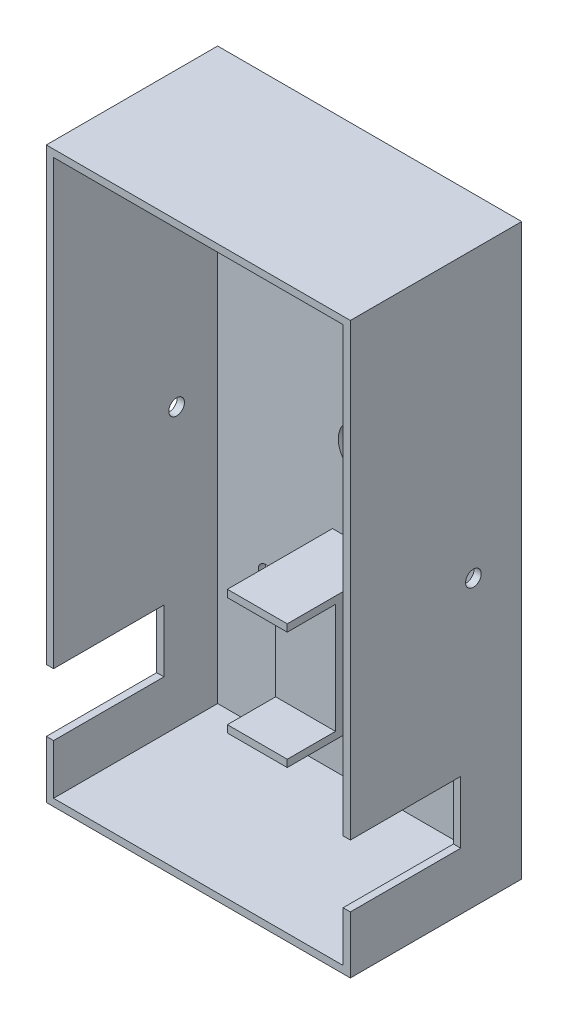
ISO-10303-21;
HEADER;
FILE_DESCRIPTION(('STEP AP214'),'2;1');
FILE_NAME('part.step','',(''),(''),'','','');
FILE_SCHEMA(('AUTOMOTIVE_DESIGN { 1 0 10303 214 1 1 1 1 }'));
ENDSEC;
DATA;
#1=APPLICATION_CONTEXT('core data for automotive mechanical design processes');
#2=APPLICATION_PROTOCOL_DEFINITION('international standard','automotive_design',2000,#1);
#3=PRODUCT_CONTEXT('',#1,'mechanical');
#4=PRODUCT('Part','Part','',(#3));
#5=PRODUCT_RELATED_PRODUCT_CATEGORY('part','',(#4));
#6=PRODUCT_DEFINITION_FORMATION('','',#4);
#7=PRODUCT_DEFINITION_CONTEXT('part definition',#1,'design');
#8=PRODUCT_DEFINITION('design','',#6,#7);
#9=PRODUCT_DEFINITION_SHAPE('','',#8);
#10=(LENGTH_UNIT() NAMED_UNIT(*) SI_UNIT(.MILLI.,.METRE.));
#11=(NAMED_UNIT(*) PLANE_ANGLE_UNIT() SI_UNIT($,.RADIAN.));
#12=(NAMED_UNIT(*) SI_UNIT($,.STERADIAN.) SOLID_ANGLE_UNIT());
#13=UNCERTAINTY_MEASURE_WITH_UNIT(LENGTH_MEASURE(1.E-05),#10,'distance_accuracy_value','');
#14=(GEOMETRIC_REPRESENTATION_CONTEXT(3) GLOBAL_UNCERTAINTY_ASSIGNED_CONTEXT((#13)) GLOBAL_UNIT_ASSIGNED_CONTEXT((#10,
#11,#12)) REPRESENTATION_CONTEXT('',''));
#15=CARTESIAN_POINT('',(0.,0.,0.));
#16=DIRECTION('',(0.,0.,1.));
#17=DIRECTION('',(1.,0.,0.));
#18=AXIS2_PLACEMENT_3D('',#15,#16,#17);
#19=CARTESIAN_POINT('',(30.,18.25,21.78));
#20=DIRECTION('',(0.,0.,1.));
#21=DIRECTION('',(1.,0.,0.));
#22=AXIS2_PLACEMENT_3D('',#19,#20,#21);
#23=PLANE('',#22);
#24=DIRECTION('',(0.,1.,0.));
#25=VECTOR('',#24,1.);
#26=CARTESIAN_POINT('',(36.2,73.8,21.78));
#27=LINE('',#26,#25);
#28=CARTESIAN_POINT('',(36.2,17.5,21.78));
#29=VERTEX_POINT('',#28);
#30=CARTESIAN_POINT('',(36.2,19.,21.78));
#31=VERTEX_POINT('',#30);
#32=EDGE_CURVE('E195',#29,#31,#27,.T.);
#33=ORIENTED_EDGE('',*,*,#32,.T.);
#34=DIRECTION('',(1.,0.,0.));
#35=VECTOR('',#34,1.);
#36=CARTESIAN_POINT('',(36.2,19.,21.78));
#37=LINE('',#36,#35);
#38=CARTESIAN_POINT('',(23.8,19.,21.78));
#39=VERTEX_POINT('',#38);
#40=EDGE_CURVE('E182',#39,#31,#37,.T.);
#41=ORIENTED_EDGE('',*,*,#40,.F.);
#42=DIRECTION('',(0.,1.,0.));
#43=VECTOR('',#42,1.);
#44=CARTESIAN_POINT('',(23.8,18.25,21.78));
#45=LINE('',#44,#43);
#46=CARTESIAN_POINT('',(23.8,17.5,21.78));
#47=VERTEX_POINT('',#46);
#48=EDGE_CURVE('E189',#39,#47,#45,.F.);
#49=ORIENTED_EDGE('',*,*,#48,.T.);
#50=DIRECTION('',(1.,0.,0.));
#51=VECTOR('',#50,1.);
#52=CARTESIAN_POINT('',(23.8,17.5,21.78));
#53=LINE('',#52,#51);
#54=EDGE_CURVE('E202',#29,#47,#53,.F.);
#55=ORIENTED_EDGE('',*,*,#54,.F.);
#56=EDGE_LOOP('',(#33,#41,#49,#55));
#57=FACE_BOUND('',#56,.T.);
#58=ADVANCED_FACE('F16',(#57),#23,.T.);
#59=CARTESIAN_POINT('',(36.2,19.,11.78));
#60=DIRECTION('',(0.,1.,0.));
#61=DIRECTION('',(0.,0.,1.));
#62=AXIS2_PLACEMENT_3D('',#59,#60,#61);
#63=PLANE('',#62);
#64=ORIENTED_EDGE('',*,*,#40,.T.);
#65=DIRECTION('',(0.,0.,1.));
#66=VECTOR('',#65,1.);
#67=CARTESIAN_POINT('',(36.2,19.,0.));
#68=LINE('',#67,#66);
#69=CARTESIAN_POINT('',(36.2,19.,11.78));
#70=VERTEX_POINT('',#69);
#71=EDGE_CURVE('E185',#31,#70,#68,.F.);
#72=ORIENTED_EDGE('',*,*,#71,.T.);
#73=DIRECTION('',(1.,0.,0.));
#74=VECTOR('',#73,1.);
#75=CARTESIAN_POINT('',(26.9,19.,11.78));
#76=LINE('',#75,#74);
#77=CARTESIAN_POINT('',(23.8,19.,11.78));
#78=VERTEX_POINT('',#77);
#79=EDGE_CURVE('E175',#78,#70,#76,.T.);
#80=ORIENTED_EDGE('',*,*,#79,.F.);
#81=DIRECTION('',(0.,0.,1.));
#82=VECTOR('',#81,1.);
#83=CARTESIAN_POINT('',(23.8,19.,0.));
#84=LINE('',#83,#82);
#85=EDGE_CURVE('E186',#39,#78,#84,.F.);
#86=ORIENTED_EDGE('',*,*,#85,.F.);
#87=EDGE_LOOP('',(#64,#72,#80,#86));
#88=FACE_BOUND('',#87,.T.);
#89=ADVANCED_FACE('F184',(#88),#63,.T.);
#90=CARTESIAN_POINT('',(26.9,60.9,11.78));
#91=DIRECTION('',(0.,0.,1.));
#92=DIRECTION('',(1.,0.,0.));
#93=AXIS2_PLACEMENT_3D('',#90,#91,#92);
#94=PLANE('',#93);
#95=DIRECTION('',(1.,0.,0.));
#96=VECTOR('',#95,1.);
#97=CARTESIAN_POINT('',(23.8,41.8,11.78));
#98=LINE('',#97,#96);
#99=CARTESIAN_POINT('',(23.8,41.8,11.78));
#100=VERTEX_POINT('',#99);
#101=CARTESIAN_POINT('',(36.2,41.8,11.78));
#102=VERTEX_POINT('',#101);
#103=EDGE_CURVE('E216',#100,#102,#98,.T.);
#104=ORIENTED_EDGE('',*,*,#103,.F.);
#105=DIRECTION('',(0.,1.,0.));
#106=VECTOR('',#105,1.);
#107=CARTESIAN_POINT('',(23.8,73.8,11.78));
#108=LINE('',#107,#106);
#109=EDGE_CURVE('E323',#78,#100,#108,.T.);
#110=ORIENTED_EDGE('',*,*,#109,.F.);
#111=ORIENTED_EDGE('',*,*,#79,.T.);
#112=DIRECTION('',(0.,1.,0.));
#113=VECTOR('',#112,1.);
#114=CARTESIAN_POINT('',(36.2,73.8,11.78));
#115=LINE('',#114,#113);
#116=EDGE_CURVE('E198',#70,#102,#115,.T.);
#117=ORIENTED_EDGE('',*,*,#116,.T.);
#118=EDGE_LOOP('',(#104,#110,#111,#117));
#119=FACE_BOUND('',#118,.T.);
#120=ADVANCED_FACE('F337',(#119),#94,.T.);
#121=CARTESIAN_POINT('',(23.8,41.8,11.78));
#122=DIRECTION('',(0.,-1.,0.));
#123=DIRECTION('',(0.,0.,-1.));
#124=AXIS2_PLACEMENT_3D('',#121,#122,#123);
#125=PLANE('',#124);
#126=DIRECTION('',(1.,0.,0.));
#127=VECTOR('',#126,1.);
#128=CARTESIAN_POINT('',(30.,41.8,21.78));
#129=LINE('',#128,#127);
#130=CARTESIAN_POINT('',(23.8,41.8,21.78));
#131=VERTEX_POINT('',#130);
#132=CARTESIAN_POINT('',(36.2,41.8,21.78));
#133=VERTEX_POINT('',#132);
#134=EDGE_CURVE('E214',#131,#133,#129,.T.);
#135=ORIENTED_EDGE('',*,*,#134,.F.);
#136=DIRECTION('',(0.,0.,1.));
#137=VECTOR('',#136,1.);
#138=CARTESIAN_POINT('',(23.8,41.8,0.));
#139=LINE('',#138,#137);
#140=EDGE_CURVE('E321',#100,#131,#139,.T.);
#141=ORIENTED_EDGE('',*,*,#140,.F.);
#142=ORIENTED_EDGE('',*,*,#103,.T.);
#143=DIRECTION('',(0.,0.,1.));
#144=VECTOR('',#143,1.);
#145=CARTESIAN_POINT('',(36.2,41.8,0.));
#146=LINE('',#145,#144);
#147=EDGE_CURVE('E334',#102,#133,#146,.T.);
#148=ORIENTED_EDGE('',*,*,#147,.T.);
#149=EDGE_LOOP('',(#135,#141,#142,#148));
#150=FACE_BOUND('',#149,.T.);
#151=ADVANCED_FACE('F341',(#150),#125,.T.);
#152=CARTESIAN_POINT('',(30.,42.55,21.78));
#153=DIRECTION('',(0.,0.,1.));
#154=DIRECTION('',(1.,0.,0.));
#155=AXIS2_PLACEMENT_3D('',#152,#153,#154);
#156=PLANE('',#155);
#157=DIRECTION('',(1.,0.,0.));
#158=VECTOR('',#157,1.);
#159=CARTESIAN_POINT('',(30.,43.3,21.78));
#160=LINE('',#159,#158);
#161=CARTESIAN_POINT('',(36.2,43.3,21.78));
#162=VERTEX_POINT('',#161);
#163=CARTESIAN_POINT('',(23.8,43.3,21.78));
#164=VERTEX_POINT('',#163);
#165=EDGE_CURVE('E313',#162,#164,#160,.F.);
#166=ORIENTED_EDGE('',*,*,#165,.T.);
#167=DIRECTION('',(0.,1.,0.));
#168=VECTOR('',#167,1.);
#169=CARTESIAN_POINT('',(23.8,73.8,21.78));
#170=LINE('',#169,#168);
#171=EDGE_CURVE('E319',#131,#164,#170,.T.);
#172=ORIENTED_EDGE('',*,*,#171,.F.);
#173=ORIENTED_EDGE('',*,*,#134,.T.);
#174=DIRECTION('',(0.,1.,0.));
#175=VECTOR('',#174,1.);
#176=CARTESIAN_POINT('',(36.2,73.8,21.78));
#177=LINE('',#176,#175);
#178=EDGE_CURVE('E332',#133,#162,#177,.T.);
#179=ORIENTED_EDGE('',*,*,#178,.T.);
#180=EDGE_LOOP('',(#166,#172,#173,#179));
#181=FACE_BOUND('',#180,.T.);
#182=ADVANCED_FACE('F462',(#181),#156,.T.);
#183=CARTESIAN_POINT('',(0.,115.,0.));
#184=DIRECTION('',(0.,-1.,0.));
#185=DIRECTION('',(0.,0.,-1.));
#186=AXIS2_PLACEMENT_3D('',#183,#184,#185);
#187=PLANE('',#186);
#188=DIRECTION('',(1.,0.,0.));
#189=VECTOR('',#188,1.);
#190=CARTESIAN_POINT('',(30.,115.,34.));
#191=LINE('',#190,#189);
#192=CARTESIAN_POINT('',(0.,115.,34.));
#193=VERTEX_POINT('',#192);
#194=CARTESIAN_POINT('',(60.,115.,34.));
#195=VERTEX_POINT('',#194);
#196=EDGE_CURVE('E279',#193,#195,#191,.T.);
#197=ORIENTED_EDGE('',*,*,#196,.F.);
#198=DIRECTION('',(0.,0.,-1.));
#199=VECTOR('',#198,1.);
#200=CARTESIAN_POINT('',(0.,115.,0.));
#201=LINE('',#200,#199);
#202=CARTESIAN_POINT('',(0.,115.,0.));
#203=VERTEX_POINT('',#202);
#204=EDGE_CURVE('E212',#203,#193,#201,.F.);
#205=ORIENTED_EDGE('',*,*,#204,.F.);
#206=DIRECTION('',(1.,0.,0.));
#207=VECTOR('',#206,1.);
#208=CARTESIAN_POINT('',(30.,115.,0.));
#209=LINE('',#208,#207);
#210=CARTESIAN_POINT('',(60.,115.,0.));
#211=VERTEX_POINT('',#210);
#212=EDGE_CURVE('E368',#211,#203,#209,.F.);
#213=ORIENTED_EDGE('',*,*,#212,.F.);
#214=DIRECTION('',(0.,0.,1.));
#215=VECTOR('',#214,1.);
#216=CARTESIAN_POINT('',(60.,115.,0.));
#217=LINE('',#216,#215);
#218=EDGE_CURVE('E205',#195,#211,#217,.F.);
#219=ORIENTED_EDGE('',*,*,#218,.F.);
#220=EDGE_LOOP('',(#197,#205,#213,#219));
#221=FACE_BOUND('',#220,.T.);
#222=ADVANCED_FACE('F407',(#221),#187,.T.);
#223=CARTESIAN_POINT('',(0.,0.,0.));
#224=DIRECTION('',(1.,0.,0.));
#225=DIRECTION('',(0.,0.,-1.));
#226=AXIS2_PLACEMENT_3D('',#223,#224,#225);
#227=PLANE('',#226);
#228=CARTESIAN_POINT('',(0.,57.5,8.5));
#229=DIRECTION('',(-1.,0.,0.));
#230=DIRECTION('',(0.,0.,1.));
#231=AXIS2_PLACEMENT_3D('',#228,#229,#230);
#232=CIRCLE('',#231,1.6256);
#233=CARTESIAN_POINT('',(0.,57.5,10.1256));
#234=VERTEX_POINT('',#233);
#235=EDGE_CURVE('E257',#234,#234,#232,.T.);
#236=ORIENTED_EDGE('',*,*,#235,.T.);
#237=EDGE_LOOP('',(#236));
#238=FACE_BOUND('',#237,.T.);
#239=ORIENTED_EDGE('',*,*,#204,.T.);
#240=DIRECTION('',(0.,1.,0.));
#241=VECTOR('',#240,1.);
#242=CARTESIAN_POINT('',(0.,57.5,34.));
#243=LINE('',#242,#241);
#244=CARTESIAN_POINT('',(0.,23.25,34.));
#245=VERTEX_POINT('',#244);
#246=EDGE_CURVE('E281',#245,#193,#243,.T.);
#247=ORIENTED_EDGE('',*,*,#246,.F.);
#248=DIRECTION('',(0.,0.,1.));
#249=VECTOR('',#248,1.);
#250=CARTESIAN_POINT('',(0.,23.25,34.));
#251=LINE('',#250,#249);
#252=CARTESIAN_POINT('',(0.,23.25,11.13));
#253=VERTEX_POINT('',#252);
#254=EDGE_CURVE('E287',#245,#253,#251,.F.);
#255=ORIENTED_EDGE('',*,*,#254,.T.);
#256=DIRECTION('',(0.,1.,0.));
#257=VECTOR('',#256,1.);
#258=CARTESIAN_POINT('',(0.,16.25,11.13));
#259=LINE('',#258,#257);
#260=CARTESIAN_POINT('',(0.,10.36,11.13));
#261=VERTEX_POINT('',#260);
#262=EDGE_CURVE('E293',#253,#261,#259,.F.);
#263=ORIENTED_EDGE('',*,*,#262,.T.);
#264=DIRECTION('',(0.,0.,-1.));
#265=VECTOR('',#264,1.);
#266=CARTESIAN_POINT('',(0.,10.36,11.13));
#267=LINE('',#266,#265);
#268=CARTESIAN_POINT('',(0.,10.36,34.));
#269=VERTEX_POINT('',#268);
#270=EDGE_CURVE('E260',#261,#269,#267,.F.);
#271=ORIENTED_EDGE('',*,*,#270,.T.);
#272=DIRECTION('',(0.,1.,0.));
#273=VECTOR('',#272,1.);
#274=CARTESIAN_POINT('',(0.,57.5,34.));
#275=LINE('',#274,#273);
#276=CARTESIAN_POINT('',(0.,0.,34.));
#277=VERTEX_POINT('',#276);
#278=EDGE_CURVE('E370',#277,#269,#275,.T.);
#279=ORIENTED_EDGE('',*,*,#278,.F.);
#280=DIRECTION('',(0.,0.,1.));
#281=VECTOR('',#280,1.);
#282=CARTESIAN_POINT('',(0.,0.,0.));
#283=LINE('',#282,#281);
#284=CARTESIAN_POINT('',(0.,0.,0.));
#285=VERTEX_POINT('',#284);
#286=EDGE_CURVE('E210',#285,#277,#283,.T.);
#287=ORIENTED_EDGE('',*,*,#286,.F.);
#288=DIRECTION('',(0.,1.,0.));
#289=VECTOR('',#288,1.);
#290=CARTESIAN_POINT('',(0.,57.5,0.));
#291=LINE('',#290,#289);
#292=EDGE_CURVE('E366',#203,#285,#291,.F.);
#293=ORIENTED_EDGE('',*,*,#292,.F.);
#294=EDGE_LOOP('',(#239,#247,#255,#263,#271,#279,#287,#293));
#295=FACE_BOUND('',#294,.T.);
#296=ADVANCED_FACE('F397',(#238,#295),#227,.T.);
#297=CARTESIAN_POINT('',(60.,0.,0.));
#298=DIRECTION('',(0.,1.,0.));
#299=DIRECTION('',(0.,0.,1.));
#300=AXIS2_PLACEMENT_3D('',#297,#298,#299);
#301=PLANE('',#300);
#302=DIRECTION('',(1.,0.,0.));
#303=VECTOR('',#302,1.);
#304=CARTESIAN_POINT('',(30.,0.,34.));
#305=LINE('',#304,#303);
#306=CARTESIAN_POINT('',(60.,0.,34.));
#307=VERTEX_POINT('',#306);
#308=EDGE_CURVE('E372',#307,#277,#305,.F.);
#309=ORIENTED_EDGE('',*,*,#308,.F.);
#310=DIRECTION('',(0.,0.,1.));
#311=VECTOR('',#310,1.);
#312=CARTESIAN_POINT('',(60.,0.,0.));
#313=LINE('',#312,#311);
#314=CARTESIAN_POINT('',(60.,0.,0.));
#315=VERTEX_POINT('',#314);
#316=EDGE_CURVE('E203',#315,#307,#313,.T.);
#317=ORIENTED_EDGE('',*,*,#316,.F.);
#318=DIRECTION('',(1.,0.,0.));
#319=VECTOR('',#318,1.);
#320=CARTESIAN_POINT('',(30.,0.,0.));
#321=LINE('',#320,#319);
#322=EDGE_CURVE('E361',#285,#315,#321,.T.);
#323=ORIENTED_EDGE('',*,*,#322,.F.);
#324=ORIENTED_EDGE('',*,*,#286,.T.);
#325=EDGE_LOOP('',(#309,#317,#323,#324));
#326=FACE_BOUND('',#325,.T.);
#327=ADVANCED_FACE('F394',(#326),#301,.T.);
#328=CARTESIAN_POINT('',(60.,115.,0.));
#329=DIRECTION('',(-1.,0.,0.));
#330=DIRECTION('',(0.,0.,1.));
#331=AXIS2_PLACEMENT_3D('',#328,#329,#330);
#332=PLANE('',#331);
#333=CARTESIAN_POINT('',(60.,57.5,8.5));
#334=DIRECTION('',(-1.,0.,0.));
#335=DIRECTION('',(0.,0.,1.));
#336=AXIS2_PLACEMENT_3D('',#333,#334,#335);
#337=CIRCLE('',#336,1.6256);
#338=CARTESIAN_POINT('',(60.,57.5,10.1256));
#339=VERTEX_POINT('',#338);
#340=EDGE_CURVE('E19',#339,#339,#337,.F.);
#341=ORIENTED_EDGE('',*,*,#340,.T.);
#342=EDGE_LOOP('',(#341));
#343=FACE_BOUND('',#342,.T.);
#344=DIRECTION('',(0.,0.,-1.));
#345=VECTOR('',#344,1.);
#346=CARTESIAN_POINT('',(60.,10.36,11.13));
#347=LINE('',#346,#345);
#348=CARTESIAN_POINT('',(60.,10.36,34.));
#349=VERTEX_POINT('',#348);
#350=CARTESIAN_POINT('',(60.,10.36,11.13));
#351=VERTEX_POINT('',#350);
#352=EDGE_CURVE('E295',#349,#351,#347,.T.);
#353=ORIENTED_EDGE('',*,*,#352,.T.);
#354=DIRECTION('',(0.,1.,0.));
#355=VECTOR('',#354,1.);
#356=CARTESIAN_POINT('',(60.,16.25,11.13));
#357=LINE('',#356,#355);
#358=CARTESIAN_POINT('',(60.,23.25,11.13));
#359=VERTEX_POINT('',#358);
#360=EDGE_CURVE('E301',#351,#359,#357,.T.);
#361=ORIENTED_EDGE('',*,*,#360,.T.);
#362=DIRECTION('',(0.,0.,1.));
#363=VECTOR('',#362,1.);
#364=CARTESIAN_POINT('',(60.,23.25,34.));
#365=LINE('',#364,#363);
#366=CARTESIAN_POINT('',(60.,23.25,34.));
#367=VERTEX_POINT('',#366);
#368=EDGE_CURVE('E307',#359,#367,#365,.T.);
#369=ORIENTED_EDGE('',*,*,#368,.T.);
#370=DIRECTION('',(0.,1.,0.));
#371=VECTOR('',#370,1.);
#372=CARTESIAN_POINT('',(60.,57.5,34.));
#373=LINE('',#372,#371);
#374=EDGE_CURVE('E277',#195,#367,#373,.F.);
#375=ORIENTED_EDGE('',*,*,#374,.F.);
#376=ORIENTED_EDGE('',*,*,#218,.T.);
#377=DIRECTION('',(0.,1.,0.));
#378=VECTOR('',#377,1.);
#379=CARTESIAN_POINT('',(60.,57.5,0.));
#380=LINE('',#379,#378);
#381=EDGE_CURVE('E356',#315,#211,#380,.T.);
#382=ORIENTED_EDGE('',*,*,#381,.F.);
#383=ORIENTED_EDGE('',*,*,#316,.T.);
#384=DIRECTION('',(0.,1.,0.));
#385=VECTOR('',#384,1.);
#386=CARTESIAN_POINT('',(60.,57.5,34.));
#387=LINE('',#386,#385);
#388=EDGE_CURVE('E375',#349,#307,#387,.F.);
#389=ORIENTED_EDGE('',*,*,#388,.F.);
#390=EDGE_LOOP('',(#353,#361,#369,#375,#376,#382,#383,#389));
#391=FACE_BOUND('',#390,.T.);
#392=ADVANCED_FACE('F389',(#343,#391),#332,.T.);
#393=CARTESIAN_POINT('',(36.2,73.8,0.));
#394=DIRECTION('',(-1.,0.,0.));
#395=DIRECTION('',(0.,0.,1.));
#396=AXIS2_PLACEMENT_3D('',#393,#394,#395);
#397=PLANE('',#396);
#398=ORIENTED_EDGE('',*,*,#178,.F.);
#399=ORIENTED_EDGE('',*,*,#147,.F.);
#400=ORIENTED_EDGE('',*,*,#116,.F.);
#401=ORIENTED_EDGE('',*,*,#71,.F.);
#402=ORIENTED_EDGE('',*,*,#32,.F.);
#403=DIRECTION('',(0.,0.,-1.));
#404=VECTOR('',#403,1.);
#405=CARTESIAN_POINT('',(36.2,17.5,0.));
#406=LINE('',#405,#404);
#407=CARTESIAN_POINT('',(36.2,17.5,0.));
#408=VERTEX_POINT('',#407);
#409=EDGE_CURVE('E330',#408,#29,#406,.F.);
#410=ORIENTED_EDGE('',*,*,#409,.F.);
#411=DIRECTION('',(0.,1.,0.));
#412=VECTOR('',#411,1.);
#413=CARTESIAN_POINT('',(36.2,57.5,0.));
#414=LINE('',#413,#412);
#415=CARTESIAN_POINT('',(36.2,43.3,0.));
#416=VERTEX_POINT('',#415);
#417=EDGE_CURVE('E353',#416,#408,#414,.F.);
#418=ORIENTED_EDGE('',*,*,#417,.F.);
#419=DIRECTION('',(0.,0.,-1.));
#420=VECTOR('',#419,1.);
#421=CARTESIAN_POINT('',(36.2,43.3,0.));
#422=LINE('',#421,#420);
#423=EDGE_CURVE('E316',#416,#162,#422,.F.);
#424=ORIENTED_EDGE('',*,*,#423,.T.);
#425=EDGE_LOOP('',(#398,#399,#400,#401,#402,#410,#418,#424));
#426=FACE_BOUND('',#425,.T.);
#427=ADVANCED_FACE('F193',(#426),#397,.F.);
#428=CARTESIAN_POINT('',(23.8,17.5,0.));
#429=DIRECTION('',(0.,-1.,0.));
#430=DIRECTION('',(0.,0.,-1.));
#431=AXIS2_PLACEMENT_3D('',#428,#429,#430);
#432=PLANE('',#431);
#433=ORIENTED_EDGE('',*,*,#54,.T.);
#434=DIRECTION('',(0.,0.,1.));
#435=VECTOR('',#434,1.);
#436=CARTESIAN_POINT('',(23.8,17.5,0.));
#437=LINE('',#436,#435);
#438=CARTESIAN_POINT('',(23.8,17.5,0.));
#439=VERTEX_POINT('',#438);
#440=EDGE_CURVE('E326',#439,#47,#437,.T.);
#441=ORIENTED_EDGE('',*,*,#440,.F.);
#442=DIRECTION('',(1.,0.,0.));
#443=VECTOR('',#442,1.);
#444=CARTESIAN_POINT('',(30.,17.5,0.));
#445=LINE('',#444,#443);
#446=EDGE_CURVE('E351',#408,#439,#445,.F.);
#447=ORIENTED_EDGE('',*,*,#446,.F.);
#448=ORIENTED_EDGE('',*,*,#409,.T.);
#449=EDGE_LOOP('',(#433,#441,#447,#448));
#450=FACE_BOUND('',#449,.T.);
#451=ADVANCED_FACE('F349',(#450),#432,.T.);
#452=CARTESIAN_POINT('',(23.8,73.8,0.));
#453=DIRECTION('',(-1.,0.,0.));
#454=DIRECTION('',(0.,0.,1.));
#455=AXIS2_PLACEMENT_3D('',#452,#453,#454);
#456=PLANE('',#455);
#457=ORIENTED_EDGE('',*,*,#140,.T.);
#458=ORIENTED_EDGE('',*,*,#171,.T.);
#459=DIRECTION('',(0.,0.,-1.));
#460=VECTOR('',#459,1.);
#461=CARTESIAN_POINT('',(23.8,43.3,0.));
#462=LINE('',#461,#460);
#463=CARTESIAN_POINT('',(23.8,43.3,0.));
#464=VERTEX_POINT('',#463);
#465=EDGE_CURVE('E310',#164,#464,#462,.T.);
#466=ORIENTED_EDGE('',*,*,#465,.T.);
#467=DIRECTION('',(0.,1.,0.));
#468=VECTOR('',#467,1.);
#469=CARTESIAN_POINT('',(23.8,57.5,0.));
#470=LINE('',#469,#468);
#471=EDGE_CURVE('E358',#439,#464,#470,.T.);
#472=ORIENTED_EDGE('',*,*,#471,.F.);
#473=ORIENTED_EDGE('',*,*,#440,.T.);
#474=ORIENTED_EDGE('',*,*,#48,.F.);
#475=ORIENTED_EDGE('',*,*,#85,.T.);
#476=ORIENTED_EDGE('',*,*,#109,.T.);
#477=EDGE_LOOP('',(#457,#458,#466,#472,#473,#474,#475,#476));
#478=FACE_BOUND('',#477,.T.);
#479=ADVANCED_FACE('F344',(#478),#456,.T.);
#480=CARTESIAN_POINT('',(30.,43.3,0.));
#481=DIRECTION('',(0.,-1.,0.));
#482=DIRECTION('',(0.,0.,-1.));
#483=AXIS2_PLACEMENT_3D('',#480,#481,#482);
#484=PLANE('',#483);
#485=ORIENTED_EDGE('',*,*,#465,.F.);
#486=ORIENTED_EDGE('',*,*,#165,.F.);
#487=ORIENTED_EDGE('',*,*,#423,.F.);
#488=DIRECTION('',(1.,0.,0.));
#489=VECTOR('',#488,1.);
#490=CARTESIAN_POINT('',(30.,43.3,0.));
#491=LINE('',#490,#489);
#492=EDGE_CURVE('E455',#464,#416,#491,.T.);
#493=ORIENTED_EDGE('',*,*,#492,.F.);
#494=EDGE_LOOP('',(#485,#486,#487,#493));
#495=FACE_BOUND('',#494,.T.);
#496=ADVANCED_FACE('F460',(#495),#484,.F.);
#497=CARTESIAN_POINT('',(61.5,23.25,34.));
#498=DIRECTION('',(0.,1.,0.));
#499=DIRECTION('',(0.,0.,1.));
#500=AXIS2_PLACEMENT_3D('',#497,#498,#499);
#501=PLANE('',#500);
#502=DIRECTION('',(-1.,0.,0.));
#503=VECTOR('',#502,1.);
#504=CARTESIAN_POINT('',(61.5,23.25,11.13));
#505=LINE('',#504,#503);
#506=CARTESIAN_POINT('',(61.5,23.25,11.13));
#507=VERTEX_POINT('',#506);
#508=EDGE_CURVE('E304',#359,#507,#505,.F.);
#509=ORIENTED_EDGE('',*,*,#508,.T.);
#510=DIRECTION('',(0.,0.,-1.));
#511=VECTOR('',#510,1.);
#512=CARTESIAN_POINT('',(61.5,23.25,0.));
#513=LINE('',#512,#511);
#514=CARTESIAN_POINT('',(61.5,23.25,34.));
#515=VERTEX_POINT('',#514);
#516=EDGE_CURVE('E453',#515,#507,#513,.T.);
#517=ORIENTED_EDGE('',*,*,#516,.F.);
#518=DIRECTION('',(1.,0.,0.));
#519=VECTOR('',#518,1.);
#520=CARTESIAN_POINT('',(30.,23.25,34.));
#521=LINE('',#520,#519);
#522=EDGE_CURVE('E272',#367,#515,#521,.T.);
#523=ORIENTED_EDGE('',*,*,#522,.F.);
#524=ORIENTED_EDGE('',*,*,#368,.F.);
#525=EDGE_LOOP('',(#509,#517,#523,#524));
#526=FACE_BOUND('',#525,.T.);
#527=ADVANCED_FACE('F541',(#526),#501,.F.);
#528=CARTESIAN_POINT('',(61.5,16.25,11.13));
#529=DIRECTION('',(0.,0.,-1.));
#530=DIRECTION('',(-1.,0.,0.));
#531=AXIS2_PLACEMENT_3D('',#528,#529,#530);
#532=PLANE('',#531);
#533=DIRECTION('',(1.,0.,0.));
#534=VECTOR('',#533,1.);
#535=CARTESIAN_POINT('',(61.5,10.36,11.13));
#536=LINE('',#535,#534);
#537=CARTESIAN_POINT('',(61.5,10.36,11.13));
#538=VERTEX_POINT('',#537);
#539=EDGE_CURVE('E298',#351,#538,#536,.T.);
#540=ORIENTED_EDGE('',*,*,#539,.T.);
#541=DIRECTION('',(0.,1.,0.));
#542=VECTOR('',#541,1.);
#543=CARTESIAN_POINT('',(61.5,-1.5,11.13));
#544=LINE('',#543,#542);
#545=EDGE_CURVE('E451',#507,#538,#544,.F.);
#546=ORIENTED_EDGE('',*,*,#545,.F.);
#547=ORIENTED_EDGE('',*,*,#508,.F.);
#548=ORIENTED_EDGE('',*,*,#360,.F.);
#549=EDGE_LOOP('',(#540,#546,#547,#548));
#550=FACE_BOUND('',#549,.T.);
#551=ADVANCED_FACE('F538',(#550),#532,.F.);
#552=CARTESIAN_POINT('',(61.5,10.36,11.13));
#553=DIRECTION('',(0.,-1.,0.));
#554=DIRECTION('',(0.,0.,-1.));
#555=AXIS2_PLACEMENT_3D('',#552,#553,#554);
#556=PLANE('',#555);
#557=DIRECTION('',(1.,0.,0.));
#558=VECTOR('',#557,1.);
#559=CARTESIAN_POINT('',(30.,10.36,34.));
#560=LINE('',#559,#558);
#561=CARTESIAN_POINT('',(61.5,10.36,34.));
#562=VERTEX_POINT('',#561);
#563=EDGE_CURVE('E263',#562,#349,#560,.F.);
#564=ORIENTED_EDGE('',*,*,#563,.F.);
#565=DIRECTION('',(0.,0.,-1.));
#566=VECTOR('',#565,1.);
#567=CARTESIAN_POINT('',(61.5,10.36,0.));
#568=LINE('',#567,#566);
#569=EDGE_CURVE('E449',#538,#562,#568,.F.);
#570=ORIENTED_EDGE('',*,*,#569,.F.);
#571=ORIENTED_EDGE('',*,*,#539,.F.);
#572=ORIENTED_EDGE('',*,*,#352,.F.);
#573=EDGE_LOOP('',(#564,#570,#571,#572));
#574=FACE_BOUND('',#573,.T.);
#575=ADVANCED_FACE('F534',(#574),#556,.F.);
#576=CARTESIAN_POINT('',(61.5,57.5,8.5));
#577=DIRECTION('',(-1.,0.,0.));
#578=DIRECTION('',(0.,0.,1.));
#579=AXIS2_PLACEMENT_3D('',#576,#577,#578);
#580=CYLINDRICAL_SURFACE('',#579,1.6256);
#581=ORIENTED_EDGE('',*,*,#340,.F.);
#582=EDGE_LOOP('',(#581));
#583=FACE_BOUND('',#582,.T.);
#584=CARTESIAN_POINT('',(61.5,57.5,8.5));
#585=DIRECTION('',(-1.,0.,0.));
#586=DIRECTION('',(0.,0.,1.));
#587=AXIS2_PLACEMENT_3D('',#584,#585,#586);
#588=CIRCLE('',#587,1.6256);
#589=CARTESIAN_POINT('',(61.5,57.5,10.1256));
#590=VERTEX_POINT('',#589);
#591=EDGE_CURVE('E253',#590,#590,#588,.T.);
#592=ORIENTED_EDGE('',*,*,#591,.F.);
#593=EDGE_LOOP('',(#592));
#594=FACE_BOUND('',#593,.T.);
#595=ADVANCED_FACE('F531',(#583,#594),#580,.F.);
#596=CARTESIAN_POINT('',(61.5,16.25,11.13));
#597=DIRECTION('',(0.,0.,-1.));
#598=DIRECTION('',(-1.,0.,0.));
#599=AXIS2_PLACEMENT_3D('',#596,#597,#598);
#600=PLANE('',#599);
#601=DIRECTION('',(1.,0.,0.));
#602=VECTOR('',#601,1.);
#603=CARTESIAN_POINT('',(61.5,23.25,11.13));
#604=LINE('',#603,#602);
#605=CARTESIAN_POINT('',(-1.5,23.25,11.13));
#606=VERTEX_POINT('',#605);
#607=EDGE_CURVE('E290',#253,#606,#604,.F.);
#608=ORIENTED_EDGE('',*,*,#607,.T.);
#609=DIRECTION('',(0.,1.,0.));
#610=VECTOR('',#609,1.);
#611=CARTESIAN_POINT('',(-1.5,116.5,11.13));
#612=LINE('',#611,#610);
#613=CARTESIAN_POINT('',(-1.5,10.36,11.13));
#614=VERTEX_POINT('',#613);
#615=EDGE_CURVE('E422',#614,#606,#612,.T.);
#616=ORIENTED_EDGE('',*,*,#615,.F.);
#617=DIRECTION('',(1.,0.,0.));
#618=VECTOR('',#617,1.);
#619=CARTESIAN_POINT('',(61.5,10.36,11.13));
#620=LINE('',#619,#618);
#621=EDGE_CURVE('E265',#614,#261,#620,.T.);
#622=ORIENTED_EDGE('',*,*,#621,.T.);
#623=ORIENTED_EDGE('',*,*,#262,.F.);
#624=EDGE_LOOP('',(#608,#616,#622,#623));
#625=FACE_BOUND('',#624,.T.);
#626=ADVANCED_FACE('F421',(#625),#600,.F.);
#627=CARTESIAN_POINT('',(61.5,23.25,34.));
#628=DIRECTION('',(0.,1.,0.));
#629=DIRECTION('',(0.,0.,1.));
#630=AXIS2_PLACEMENT_3D('',#627,#628,#629);
#631=PLANE('',#630);
#632=DIRECTION('',(1.,0.,0.));
#633=VECTOR('',#632,1.);
#634=CARTESIAN_POINT('',(30.,23.25,34.));
#635=LINE('',#634,#633);
#636=CARTESIAN_POINT('',(-1.5,23.25,34.));
#637=VERTEX_POINT('',#636);
#638=EDGE_CURVE('E284',#637,#245,#635,.T.);
#639=ORIENTED_EDGE('',*,*,#638,.F.);
#640=DIRECTION('',(0.,0.,1.));
#641=VECTOR('',#640,1.);
#642=CARTESIAN_POINT('',(-1.5,23.25,0.));
#643=LINE('',#642,#641);
#644=EDGE_CURVE('E418',#606,#637,#643,.T.);
#645=ORIENTED_EDGE('',*,*,#644,.F.);
#646=ORIENTED_EDGE('',*,*,#607,.F.);
#647=ORIENTED_EDGE('',*,*,#254,.F.);
#648=EDGE_LOOP('',(#639,#645,#646,#647));
#649=FACE_BOUND('',#648,.T.);
#650=ADVANCED_FACE('F416',(#649),#631,.F.);
#651=CARTESIAN_POINT('',(30.,57.5,34.));
#652=DIRECTION('',(0.,0.,1.));
#653=DIRECTION('',(1.,0.,0.));
#654=AXIS2_PLACEMENT_3D('',#651,#652,#653);
#655=PLANE('',#654);
#656=DIRECTION('',(1.,0.,0.));
#657=VECTOR('',#656,1.);
#658=CARTESIAN_POINT('',(61.5,116.5,34.));
#659=LINE('',#658,#657);
#660=CARTESIAN_POINT('',(-1.5,116.5,34.));
#661=VERTEX_POINT('',#660);
#662=CARTESIAN_POINT('',(61.5,116.5,34.));
#663=VERTEX_POINT('',#662);
#664=EDGE_CURVE('E255',#661,#663,#659,.T.);
#665=ORIENTED_EDGE('',*,*,#664,.F.);
#666=DIRECTION('',(0.,1.,0.));
#667=VECTOR('',#666,1.);
#668=CARTESIAN_POINT('',(-1.5,116.5,34.));
#669=LINE('',#668,#667);
#670=EDGE_CURVE('E439',#637,#661,#669,.T.);
#671=ORIENTED_EDGE('',*,*,#670,.F.);
#672=ORIENTED_EDGE('',*,*,#638,.T.);
#673=ORIENTED_EDGE('',*,*,#246,.T.);
#674=ORIENTED_EDGE('',*,*,#196,.T.);
#675=ORIENTED_EDGE('',*,*,#374,.T.);
#676=ORIENTED_EDGE('',*,*,#522,.T.);
#677=DIRECTION('',(0.,1.,0.));
#678=VECTOR('',#677,1.);
#679=CARTESIAN_POINT('',(61.5,-1.5,34.));
#680=LINE('',#679,#678);
#681=EDGE_CURVE('E256',#663,#515,#680,.F.);
#682=ORIENTED_EDGE('',*,*,#681,.F.);
#683=EDGE_LOOP('',(#665,#671,#672,#673,#674,#675,#676,#682));
#684=FACE_BOUND('',#683,.T.);
#685=ADVANCED_FACE('F411',(#684),#655,.T.);
#686=CARTESIAN_POINT('',(61.5,10.36,11.13));
#687=DIRECTION('',(0.,-1.,0.));
#688=DIRECTION('',(0.,0.,-1.));
#689=AXIS2_PLACEMENT_3D('',#686,#687,#688);
#690=PLANE('',#689);
#691=ORIENTED_EDGE('',*,*,#621,.F.);
#692=DIRECTION('',(0.,0.,1.));
#693=VECTOR('',#692,1.);
#694=CARTESIAN_POINT('',(-1.5,10.36,0.));
#695=LINE('',#694,#693);
#696=CARTESIAN_POINT('',(-1.5,10.36,34.));
#697=VERTEX_POINT('',#696);
#698=EDGE_CURVE('E252',#697,#614,#695,.F.);
#699=ORIENTED_EDGE('',*,*,#698,.F.);
#700=DIRECTION('',(1.,0.,0.));
#701=VECTOR('',#700,1.);
#702=CARTESIAN_POINT('',(30.,10.36,34.));
#703=LINE('',#702,#701);
#704=EDGE_CURVE('E259',#269,#697,#703,.F.);
#705=ORIENTED_EDGE('',*,*,#704,.F.);
#706=ORIENTED_EDGE('',*,*,#270,.F.);
#707=EDGE_LOOP('',(#691,#699,#705,#706));
#708=FACE_BOUND('',#707,.T.);
#709=ADVANCED_FACE('F426',(#708),#690,.F.);
#710=CARTESIAN_POINT('',(61.5,57.5,8.5));
#711=DIRECTION('',(-1.,0.,0.));
#712=DIRECTION('',(0.,0.,1.));
#713=AXIS2_PLACEMENT_3D('',#710,#711,#712);
#714=CYLINDRICAL_SURFACE('',#713,1.6256);
#715=CARTESIAN_POINT('',(-1.5,57.5,8.5));
#716=DIRECTION('',(-1.,0.,0.));
#717=DIRECTION('',(0.,0.,1.));
#718=AXIS2_PLACEMENT_3D('',#715,#716,#717);
#719=CIRCLE('',#718,1.6256);
#720=CARTESIAN_POINT('',(-1.5,57.5,10.1256));
#721=VERTEX_POINT('',#720);
#722=EDGE_CURVE('E248',#721,#721,#719,.F.);
#723=ORIENTED_EDGE('',*,*,#722,.F.);
#724=EDGE_LOOP('',(#723));
#725=FACE_BOUND('',#724,.T.);
#726=ORIENTED_EDGE('',*,*,#235,.F.);
#727=EDGE_LOOP('',(#726));
#728=FACE_BOUND('',#727,.T.);
#729=ADVANCED_FACE('F519',(#725,#728),#714,.F.);
#730=CARTESIAN_POINT('',(30.,57.5,34.));
#731=DIRECTION('',(0.,0.,1.));
#732=DIRECTION('',(1.,0.,0.));
#733=AXIS2_PLACEMENT_3D('',#730,#731,#732);
#734=PLANE('',#733);
#735=ORIENTED_EDGE('',*,*,#308,.T.);
#736=ORIENTED_EDGE('',*,*,#278,.T.);
#737=ORIENTED_EDGE('',*,*,#704,.T.);
#738=DIRECTION('',(0.,1.,0.));
#739=VECTOR('',#738,1.);
#740=CARTESIAN_POINT('',(-1.5,116.5,34.));
#741=LINE('',#740,#739);
#742=CARTESIAN_POINT('',(-1.5,-1.5,34.));
#743=VERTEX_POINT('',#742);
#744=EDGE_CURVE('E431',#743,#697,#741,.T.);
#745=ORIENTED_EDGE('',*,*,#744,.F.);
#746=DIRECTION('',(1.,0.,0.));
#747=VECTOR('',#746,1.);
#748=CARTESIAN_POINT('',(-1.5,-1.5,34.));
#749=LINE('',#748,#747);
#750=CARTESIAN_POINT('',(61.5,-1.5,34.));
#751=VERTEX_POINT('',#750);
#752=EDGE_CURVE('E794',#751,#743,#749,.F.);
#753=ORIENTED_EDGE('',*,*,#752,.F.);
#754=DIRECTION('',(0.,1.,0.));
#755=VECTOR('',#754,1.);
#756=CARTESIAN_POINT('',(61.5,-1.5,34.));
#757=LINE('',#756,#755);
#758=EDGE_CURVE('E385',#562,#751,#757,.F.);
#759=ORIENTED_EDGE('',*,*,#758,.F.);
#760=ORIENTED_EDGE('',*,*,#563,.T.);
#761=ORIENTED_EDGE('',*,*,#388,.T.);
#762=EDGE_LOOP('',(#735,#736,#737,#745,#753,#759,#760,#761));
#763=FACE_BOUND('',#762,.T.);
#764=ADVANCED_FACE('F382',(#763),#734,.T.);
#765=CARTESIAN_POINT('',(30.,57.5,0.));
#766=DIRECTION('',(0.,0.,1.));
#767=DIRECTION('',(1.,0.,0.));
#768=AXIS2_PLACEMENT_3D('',#765,#766,#767);
#769=PLANE('',#768);
#770=ORIENTED_EDGE('',*,*,#471,.T.);
#771=ORIENTED_EDGE('',*,*,#492,.T.);
#772=ORIENTED_EDGE('',*,*,#417,.T.);
#773=ORIENTED_EDGE('',*,*,#446,.T.);
#774=EDGE_LOOP('',(#770,#771,#772,#773));
#775=FACE_BOUND('',#774,.T.);
#776=CARTESIAN_POINT('',(50.05,21.935,0.));
#777=DIRECTION('',(0.,0.,1.));
#778=DIRECTION('',(1.,0.,0.));
#779=AXIS2_PLACEMENT_3D('',#776,#777,#778);
#780=CIRCLE('',#779,1.525);
#781=CARTESIAN_POINT('',(51.575,21.935,0.));
#782=VERTEX_POINT('',#781);
#783=EDGE_CURVE('E232',#782,#782,#780,.F.);
#784=ORIENTED_EDGE('',*,*,#783,.T.);
#785=EDGE_LOOP('',(#784));
#786=FACE_BOUND('',#785,.T.);
#787=CARTESIAN_POINT('',(50.05,28.42,0.));
#788=DIRECTION('',(0.,0.,1.));
#789=DIRECTION('',(1.,0.,0.));
#790=AXIS2_PLACEMENT_3D('',#787,#788,#789);
#791=CIRCLE('',#790,1.525);
#792=CARTESIAN_POINT('',(51.575,28.42,0.));
#793=VERTEX_POINT('',#792);
#794=EDGE_CURVE('E236',#793,#793,#791,.F.);
#795=ORIENTED_EDGE('',*,*,#794,.T.);
#796=EDGE_LOOP('',(#795));
#797=FACE_BOUND('',#796,.T.);
#798=CARTESIAN_POINT('',(9.95,28.42,0.));
#799=DIRECTION('',(0.,0.,-1.));
#800=DIRECTION('',(-1.,0.,0.));
#801=AXIS2_PLACEMENT_3D('',#798,#799,#800);
#802=CIRCLE('',#801,1.525);
#803=CARTESIAN_POINT('',(8.425,28.42,0.));
#804=VERTEX_POINT('',#803);
#805=EDGE_CURVE('E242',#804,#804,#802,.T.);
#806=ORIENTED_EDGE('',*,*,#805,.T.);
#807=EDGE_LOOP('',(#806));
#808=FACE_BOUND('',#807,.T.);
#809=CARTESIAN_POINT('',(9.95,21.935,0.));
#810=DIRECTION('',(0.,0.,-1.));
#811=DIRECTION('',(-1.,0.,0.));
#812=AXIS2_PLACEMENT_3D('',#809,#810,#811);
#813=CIRCLE('',#812,1.525);
#814=CARTESIAN_POINT('',(8.425,21.935,0.));
#815=VERTEX_POINT('',#814);
#816=EDGE_CURVE('E239',#815,#815,#813,.T.);
#817=ORIENTED_EDGE('',*,*,#816,.T.);
#818=EDGE_LOOP('',(#817));
#819=FACE_BOUND('',#818,.T.);
#820=CARTESIAN_POINT('',(30.,60.,0.));
#821=DIRECTION('',(0.,0.,-1.));
#822=DIRECTION('',(-1.,0.,0.));
#823=AXIS2_PLACEMENT_3D('',#820,#821,#822);
#824=CIRCLE('',#823,5.);
#825=CARTESIAN_POINT('',(25.,60.,0.));
#826=VERTEX_POINT('',#825);
#827=EDGE_CURVE('E245',#826,#826,#824,.T.);
#828=ORIENTED_EDGE('',*,*,#827,.T.);
#829=EDGE_LOOP('',(#828));
#830=FACE_BOUND('',#829,.T.);
#831=ORIENTED_EDGE('',*,*,#322,.T.);
#832=ORIENTED_EDGE('',*,*,#381,.T.);
#833=ORIENTED_EDGE('',*,*,#212,.T.);
#834=ORIENTED_EDGE('',*,*,#292,.T.);
#835=EDGE_LOOP('',(#831,#832,#833,#834));
#836=FACE_BOUND('',#835,.T.);
#837=ADVANCED_FACE('F402',(#775,#786,#797,#808,#819,#830,#836),#769,.T.);
#838=CARTESIAN_POINT('',(61.5,-1.5,0.));
#839=DIRECTION('',(1.,0.,0.));
#840=DIRECTION('',(0.,0.,-1.));
#841=AXIS2_PLACEMENT_3D('',#838,#839,#840);
#842=PLANE('',#841);
#843=ORIENTED_EDGE('',*,*,#591,.T.);
#844=EDGE_LOOP('',(#843));
#845=FACE_BOUND('',#844,.T.);
#846=DIRECTION('',(0.,0.,1.));
#847=VECTOR('',#846,1.);
#848=CARTESIAN_POINT('',(61.5,116.5,0.));
#849=LINE('',#848,#847);
#850=CARTESIAN_POINT('',(61.5,116.5,-1.5));
#851=VERTEX_POINT('',#850);
#852=EDGE_CURVE('E443',#663,#851,#849,.F.);
#853=ORIENTED_EDGE('',*,*,#852,.F.);
#854=ORIENTED_EDGE('',*,*,#681,.T.);
#855=ORIENTED_EDGE('',*,*,#516,.T.);
#856=ORIENTED_EDGE('',*,*,#545,.T.);
#857=ORIENTED_EDGE('',*,*,#569,.T.);
#858=ORIENTED_EDGE('',*,*,#758,.T.);
#859=DIRECTION('',(0.,0.,-1.));
#860=VECTOR('',#859,1.);
#861=CARTESIAN_POINT('',(61.5,-1.5,0.));
#862=LINE('',#861,#860);
#863=CARTESIAN_POINT('',(61.5,-1.5,-1.5));
#864=VERTEX_POINT('',#863);
#865=EDGE_CURVE('E251',#864,#751,#862,.F.);
#866=ORIENTED_EDGE('',*,*,#865,.F.);
#867=DIRECTION('',(0.,1.,0.));
#868=VECTOR('',#867,1.);
#869=CARTESIAN_POINT('',(61.5,57.5,-1.5));
#870=LINE('',#869,#868);
#871=EDGE_CURVE('E235',#864,#851,#870,.T.);
#872=ORIENTED_EDGE('',*,*,#871,.T.);
#873=EDGE_LOOP('',(#853,#854,#855,#856,#857,#858,#866,#872));
#874=FACE_BOUND('',#873,.T.);
#875=ADVANCED_FACE('F510',(#845,#874),#842,.T.);
#876=CARTESIAN_POINT('',(61.5,116.5,0.));
#877=DIRECTION('',(0.,1.,0.));
#878=DIRECTION('',(0.,0.,1.));
#879=AXIS2_PLACEMENT_3D('',#876,#877,#878);
#880=PLANE('',#879);
#881=ORIENTED_EDGE('',*,*,#664,.T.);
#882=ORIENTED_EDGE('',*,*,#852,.T.);
#883=DIRECTION('',(1.,0.,0.));
#884=VECTOR('',#883,1.);
#885=CARTESIAN_POINT('',(30.,116.5,-1.5));
#886=LINE('',#885,#884);
#887=CARTESIAN_POINT('',(-1.5,116.5,-1.5));
#888=VERTEX_POINT('',#887);
#889=EDGE_CURVE('E784',#851,#888,#886,.F.);
#890=ORIENTED_EDGE('',*,*,#889,.T.);
#891=DIRECTION('',(0.,0.,1.));
#892=VECTOR('',#891,1.);
#893=CARTESIAN_POINT('',(-1.5,116.5,0.));
#894=LINE('',#893,#892);
#895=EDGE_CURVE('E433',#661,#888,#894,.F.);
#896=ORIENTED_EDGE('',*,*,#895,.F.);
#897=EDGE_LOOP('',(#881,#882,#890,#896));
#898=FACE_BOUND('',#897,.T.);
#899=ADVANCED_FACE('F506',(#898),#880,.T.);
#900=CARTESIAN_POINT('',(-1.5,116.5,0.));
#901=DIRECTION('',(-1.,0.,0.));
#902=DIRECTION('',(0.,0.,1.));
#903=AXIS2_PLACEMENT_3D('',#900,#901,#902);
#904=PLANE('',#903);
#905=ORIENTED_EDGE('',*,*,#722,.T.);
#906=EDGE_LOOP('',(#905));
#907=FACE_BOUND('',#906,.T.);
#908=ORIENTED_EDGE('',*,*,#744,.T.);
#909=ORIENTED_EDGE('',*,*,#698,.T.);
#910=ORIENTED_EDGE('',*,*,#615,.T.);
#911=ORIENTED_EDGE('',*,*,#644,.T.);
#912=ORIENTED_EDGE('',*,*,#670,.T.);
#913=ORIENTED_EDGE('',*,*,#895,.T.);
#914=DIRECTION('',(0.,1.,0.));
#915=VECTOR('',#914,1.);
#916=CARTESIAN_POINT('',(-1.5,57.5,-1.5));
#917=LINE('',#916,#915);
#918=CARTESIAN_POINT('',(-1.5,-1.5,-1.5));
#919=VERTEX_POINT('',#918);
#920=EDGE_CURVE('E788',#888,#919,#917,.F.);
#921=ORIENTED_EDGE('',*,*,#920,.T.);
#922=DIRECTION('',(0.,0.,-1.));
#923=VECTOR('',#922,1.);
#924=CARTESIAN_POINT('',(-1.5,-1.5,0.));
#925=LINE('',#924,#923);
#926=EDGE_CURVE('E34',#743,#919,#925,.T.);
#927=ORIENTED_EDGE('',*,*,#926,.F.);
#928=EDGE_LOOP('',(#908,#909,#910,#911,#912,#913,#921,#927));
#929=FACE_BOUND('',#928,.T.);
#930=ADVANCED_FACE('F429',(#907,#929),#904,.T.);
#931=CARTESIAN_POINT('',(-1.5,-1.5,0.));
#932=DIRECTION('',(0.,-1.,0.));
#933=DIRECTION('',(0.,0.,-1.));
#934=AXIS2_PLACEMENT_3D('',#931,#932,#933);
#935=PLANE('',#934);
#936=ORIENTED_EDGE('',*,*,#752,.T.);
#937=ORIENTED_EDGE('',*,*,#926,.T.);
#938=DIRECTION('',(1.,0.,0.));
#939=VECTOR('',#938,1.);
#940=CARTESIAN_POINT('',(30.,-1.5,-1.5));
#941=LINE('',#940,#939);
#942=EDGE_CURVE('E231',#919,#864,#941,.T.);
#943=ORIENTED_EDGE('',*,*,#942,.T.);
#944=ORIENTED_EDGE('',*,*,#865,.T.);
#945=EDGE_LOOP('',(#936,#937,#943,#944));
#946=FACE_BOUND('',#945,.T.);
#947=ADVANCED_FACE('F500',(#946),#935,.T.);
#948=CARTESIAN_POINT('',(30.,60.,0.));
#949=DIRECTION('',(0.,0.,-1.));
#950=DIRECTION('',(-1.,0.,0.));
#951=AXIS2_PLACEMENT_3D('',#948,#949,#950);
#952=CYLINDRICAL_SURFACE('',#951,5.);
#953=CARTESIAN_POINT('',(30.,60.,-1.5));
#954=DIRECTION('',(0.,0.,-1.));
#955=DIRECTION('',(-1.,0.,0.));
#956=AXIS2_PLACEMENT_3D('',#953,#954,#955);
#957=CIRCLE('',#956,5.);
#958=CARTESIAN_POINT('',(25.,60.,-1.5));
#959=VERTEX_POINT('',#958);
#960=EDGE_CURVE('E228',#959,#959,#957,.T.);
#961=ORIENTED_EDGE('',*,*,#960,.T.);
#962=EDGE_LOOP('',(#961));
#963=FACE_BOUND('',#962,.T.);
#964=ORIENTED_EDGE('',*,*,#827,.F.);
#965=EDGE_LOOP('',(#964));
#966=FACE_BOUND('',#965,.T.);
#967=ADVANCED_FACE('F496',(#963,#966),#952,.F.);
#968=CARTESIAN_POINT('',(9.95,28.42,0.));
#969=DIRECTION('',(0.,0.,-1.));
#970=DIRECTION('',(-1.,0.,0.));
#971=AXIS2_PLACEMENT_3D('',#968,#969,#970);
#972=CYLINDRICAL_SURFACE('',#971,1.525);
#973=ORIENTED_EDGE('',*,*,#805,.F.);
#974=EDGE_LOOP('',(#973));
#975=FACE_BOUND('',#974,.T.);
#976=CARTESIAN_POINT('',(9.95,28.42,-1.5));
#977=DIRECTION('',(0.,0.,-1.));
#978=DIRECTION('',(-1.,0.,0.));
#979=AXIS2_PLACEMENT_3D('',#976,#977,#978);
#980=CIRCLE('',#979,1.525);
#981=CARTESIAN_POINT('',(8.425,28.42,-1.5));
#982=VERTEX_POINT('',#981);
#983=EDGE_CURVE('E225',#982,#982,#980,.T.);
#984=ORIENTED_EDGE('',*,*,#983,.T.);
#985=EDGE_LOOP('',(#984));
#986=FACE_BOUND('',#985,.T.);
#987=ADVANCED_FACE('F492',(#975,#986),#972,.F.);
#988=CARTESIAN_POINT('',(9.95,21.935,0.));
#989=DIRECTION('',(0.,0.,-1.));
#990=DIRECTION('',(-1.,0.,0.));
#991=AXIS2_PLACEMENT_3D('',#988,#989,#990);
#992=CYLINDRICAL_SURFACE('',#991,1.525);
#993=ORIENTED_EDGE('',*,*,#816,.F.);
#994=EDGE_LOOP('',(#993));
#995=FACE_BOUND('',#994,.T.);
#996=CARTESIAN_POINT('',(9.95,21.935,-1.5));
#997=DIRECTION('',(0.,0.,-1.));
#998=DIRECTION('',(-1.,0.,0.));
#999=AXIS2_PLACEMENT_3D('',#996,#997,#998);
#1000=CIRCLE('',#999,1.525);
#1001=CARTESIAN_POINT('',(8.425,21.935,-1.5));
#1002=VERTEX_POINT('',#1001);
#1003=EDGE_CURVE('E222',#1002,#1002,#1000,.T.);
#1004=ORIENTED_EDGE('',*,*,#1003,.T.);
#1005=EDGE_LOOP('',(#1004));
#1006=FACE_BOUND('',#1005,.T.);
#1007=ADVANCED_FACE('F488',(#995,#1006),#992,.F.);
#1008=CARTESIAN_POINT('',(50.05,28.42,0.));
#1009=DIRECTION('',(0.,0.,1.));
#1010=DIRECTION('',(1.,0.,0.));
#1011=AXIS2_PLACEMENT_3D('',#1008,#1009,#1010);
#1012=CYLINDRICAL_SURFACE('',#1011,1.525);
#1013=ORIENTED_EDGE('',*,*,#794,.F.);
#1014=EDGE_LOOP('',(#1013));
#1015=FACE_BOUND('',#1014,.T.);
#1016=CARTESIAN_POINT('',(50.05,28.42,-1.5));
#1017=DIRECTION('',(0.,0.,1.));
#1018=DIRECTION('',(1.,0.,0.));
#1019=AXIS2_PLACEMENT_3D('',#1016,#1017,#1018);
#1020=CIRCLE('',#1019,1.525);
#1021=CARTESIAN_POINT('',(51.575,28.42,-1.5));
#1022=VERTEX_POINT('',#1021);
#1023=EDGE_CURVE('E25',#1022,#1022,#1020,.F.);
#1024=ORIENTED_EDGE('',*,*,#1023,.T.);
#1025=EDGE_LOOP('',(#1024));
#1026=FACE_BOUND('',#1025,.T.);
#1027=ADVANCED_FACE('F480',(#1015,#1026),#1012,.F.);
#1028=CARTESIAN_POINT('',(50.05,21.935,0.));
#1029=DIRECTION('',(0.,0.,1.));
#1030=DIRECTION('',(1.,0.,0.));
#1031=AXIS2_PLACEMENT_3D('',#1028,#1029,#1030);
#1032=CYLINDRICAL_SURFACE('',#1031,1.525);
#1033=ORIENTED_EDGE('',*,*,#783,.F.);
#1034=EDGE_LOOP('',(#1033));
#1035=FACE_BOUND('',#1034,.T.);
#1036=CARTESIAN_POINT('',(50.05,21.935,-1.5));
#1037=DIRECTION('',(0.,0.,1.));
#1038=DIRECTION('',(1.,0.,0.));
#1039=AXIS2_PLACEMENT_3D('',#1036,#1037,#1038);
#1040=CIRCLE('',#1039,1.525);
#1041=CARTESIAN_POINT('',(51.575,21.935,-1.5));
#1042=VERTEX_POINT('',#1041);
#1043=EDGE_CURVE('E10',#1042,#1042,#1040,.F.);
#1044=ORIENTED_EDGE('',*,*,#1043,.T.);
#1045=EDGE_LOOP('',(#1044));
#1046=FACE_BOUND('',#1045,.T.);
#1047=ADVANCED_FACE('F474',(#1035,#1046),#1032,.F.);
#1048=CARTESIAN_POINT('',(30.,57.5,-1.5));
#1049=DIRECTION('',(0.,0.,1.));
#1050=DIRECTION('',(1.,0.,0.));
#1051=AXIS2_PLACEMENT_3D('',#1048,#1049,#1050);
#1052=PLANE('',#1051);
#1053=ORIENTED_EDGE('',*,*,#1043,.F.);
#1054=EDGE_LOOP('',(#1053));
#1055=FACE_BOUND('',#1054,.T.);
#1056=ORIENTED_EDGE('',*,*,#1023,.F.);
#1057=EDGE_LOOP('',(#1056));
#1058=FACE_BOUND('',#1057,.T.);
#1059=ORIENTED_EDGE('',*,*,#1003,.F.);
#1060=EDGE_LOOP('',(#1059));
#1061=FACE_BOUND('',#1060,.T.);
#1062=ORIENTED_EDGE('',*,*,#983,.F.);
#1063=EDGE_LOOP('',(#1062));
#1064=FACE_BOUND('',#1063,.T.);
#1065=ORIENTED_EDGE('',*,*,#960,.F.);
#1066=EDGE_LOOP('',(#1065));
#1067=FACE_BOUND('',#1066,.T.);
#1068=ORIENTED_EDGE('',*,*,#920,.F.);
#1069=ORIENTED_EDGE('',*,*,#889,.F.);
#1070=ORIENTED_EDGE('',*,*,#871,.F.);
#1071=ORIENTED_EDGE('',*,*,#942,.F.);
#1072=EDGE_LOOP('',(#1068,#1069,#1070,#1071));
#1073=FACE_BOUND('',#1072,.T.);
#1074=ADVANCED_FACE('F472',(#1055,#1058,#1061,#1064,#1067,#1073),#1052,.F.);
#1075=CLOSED_SHELL('',(#58,#89,#120,#151,#182,#222,#296,#327,#392,#427,#451,#479,#496,#527,#551,
#575,#595,#626,#650,#685,#709,#729,#764,#837,#875,#899,#930,#947,#967,#987,#1007,#1027,#1047,#1074));
#1076=MANIFOLD_SOLID_BREP('B1',#1075);
#1077=ADVANCED_BREP_SHAPE_REPRESENTATION('',(#18,#1076),#14);
#1078=SHAPE_DEFINITION_REPRESENTATION(#9,#1077);
ENDSEC;
END-ISO-10303-21;
